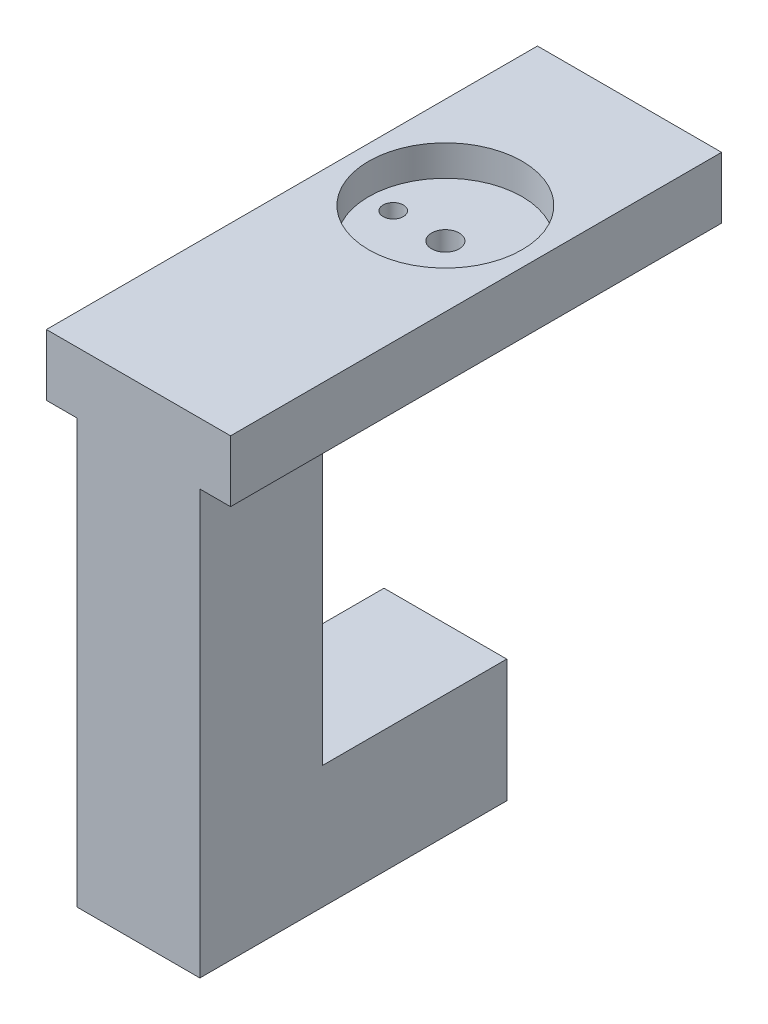
ISO-10303-21;
HEADER;
FILE_DESCRIPTION(('STEP AP214'),'2;1');
FILE_NAME('part.step','',(''),(''),'','','');
FILE_SCHEMA(('AUTOMOTIVE_DESIGN { 1 0 10303 214 1 1 1 1 }'));
ENDSEC;
DATA;
#1=APPLICATION_CONTEXT('core data for automotive mechanical design processes');
#2=APPLICATION_PROTOCOL_DEFINITION('international standard','automotive_design',2000,#1);
#3=PRODUCT_CONTEXT('',#1,'mechanical');
#4=PRODUCT('Part','Part','',(#3));
#5=PRODUCT_RELATED_PRODUCT_CATEGORY('part','',(#4));
#6=PRODUCT_DEFINITION_FORMATION('','',#4);
#7=PRODUCT_DEFINITION_CONTEXT('part definition',#1,'design');
#8=PRODUCT_DEFINITION('design','',#6,#7);
#9=PRODUCT_DEFINITION_SHAPE('','',#8);
#10=(LENGTH_UNIT() NAMED_UNIT(*) SI_UNIT(.MILLI.,.METRE.));
#11=(NAMED_UNIT(*) PLANE_ANGLE_UNIT() SI_UNIT($,.RADIAN.));
#12=(NAMED_UNIT(*) SI_UNIT($,.STERADIAN.) SOLID_ANGLE_UNIT());
#13=UNCERTAINTY_MEASURE_WITH_UNIT(LENGTH_MEASURE(1.E-05),#10,'distance_accuracy_value','');
#14=(GEOMETRIC_REPRESENTATION_CONTEXT(3) GLOBAL_UNCERTAINTY_ASSIGNED_CONTEXT((#13)) GLOBAL_UNIT_ASSIGNED_CONTEXT((#10,
#11,#12)) REPRESENTATION_CONTEXT('',''));
#15=CARTESIAN_POINT('',(0.,0.,0.));
#16=DIRECTION('',(0.,0.,1.));
#17=DIRECTION('',(1.,0.,0.));
#18=AXIS2_PLACEMENT_3D('',#15,#16,#17);
#19=CARTESIAN_POINT('',(-10.,10.,50.));
#20=DIRECTION('',(0.,-1.,0.));
#21=DIRECTION('',(0.,0.,-1.));
#22=AXIS2_PLACEMENT_3D('',#19,#20,#21);
#23=PLANE('',#22);
#24=DIRECTION('',(-1.,0.,0.));
#25=VECTOR('',#24,1.);
#26=CARTESIAN_POINT('',(-10.,10.,30.));
#27=LINE('',#26,#25);
#28=CARTESIAN_POINT('',(10.,10.,30.));
#29=VERTEX_POINT('',#28);
#30=CARTESIAN_POINT('',(-10.,10.,30.));
#31=VERTEX_POINT('',#30);
#32=EDGE_CURVE('E133',#29,#31,#27,.T.);
#33=ORIENTED_EDGE('',*,*,#32,.F.);
#34=DIRECTION('',(0.,0.,-1.));
#35=VECTOR('',#34,1.);
#36=CARTESIAN_POINT('',(10.,10.,50.));
#37=LINE('',#36,#35);
#38=CARTESIAN_POINT('',(10.,10.,0.));
#39=VERTEX_POINT('',#38);
#40=EDGE_CURVE('E54',#29,#39,#37,.T.);
#41=ORIENTED_EDGE('',*,*,#40,.T.);
#42=DIRECTION('',(-1.,0.,0.));
#43=VECTOR('',#42,1.);
#44=CARTESIAN_POINT('',(-10.,10.,0.));
#45=LINE('',#44,#43);
#46=CARTESIAN_POINT('',(-10.,10.,0.));
#47=VERTEX_POINT('',#46);
#48=EDGE_CURVE('E112',#39,#47,#45,.T.);
#49=ORIENTED_EDGE('',*,*,#48,.T.);
#50=DIRECTION('',(0.,0.,-1.));
#51=VECTOR('',#50,1.);
#52=CARTESIAN_POINT('',(-10.,10.,50.));
#53=LINE('',#52,#51);
#54=EDGE_CURVE('E127',#31,#47,#53,.T.);
#55=ORIENTED_EDGE('',*,*,#54,.F.);
#56=EDGE_LOOP('',(#33,#41,#49,#55));
#57=FACE_BOUND('',#56,.T.);
#58=ADVANCED_FACE('F44',(#57),#23,.F.);
#59=CARTESIAN_POINT('',(10.,10.,50.));
#60=DIRECTION('',(-1.,0.,0.));
#61=DIRECTION('',(0.,-1.,0.));
#62=AXIS2_PLACEMENT_3D('',#59,#60,#61);
#63=PLANE('',#62);
#64=DIRECTION('',(0.,-1.,0.));
#65=VECTOR('',#64,1.);
#66=CARTESIAN_POINT('',(10.,69.,30.));
#67=LINE('',#66,#65);
#68=CARTESIAN_POINT('',(10.,59.,30.));
#69=VERTEX_POINT('',#68);
#70=EDGE_CURVE('E60',#69,#29,#67,.T.);
#71=ORIENTED_EDGE('',*,*,#70,.F.);
#72=DIRECTION('',(0.,0.,1.));
#73=VECTOR('',#72,1.);
#74=CARTESIAN_POINT('',(9.99999999999999,59.,50.));
#75=LINE('',#74,#73);
#76=CARTESIAN_POINT('',(10.,59.,50.));
#77=VERTEX_POINT('',#76);
#78=EDGE_CURVE('E137',#69,#77,#75,.T.);
#79=ORIENTED_EDGE('',*,*,#78,.T.);
#80=DIRECTION('',(0.,1.,0.));
#81=VECTOR('',#80,1.);
#82=CARTESIAN_POINT('',(10.,10.,50.));
#83=LINE('',#82,#81);
#84=CARTESIAN_POINT('',(10.,-10.,50.));
#85=VERTEX_POINT('',#84);
#86=EDGE_CURVE('E99',#85,#77,#83,.T.);
#87=ORIENTED_EDGE('',*,*,#86,.F.);
#88=DIRECTION('',(0.,0.,-1.));
#89=VECTOR('',#88,1.);
#90=CARTESIAN_POINT('',(10.,-10.,50.));
#91=LINE('',#90,#89);
#92=CARTESIAN_POINT('',(10.,-10.,0.));
#93=VERTEX_POINT('',#92);
#94=EDGE_CURVE('E91',#85,#93,#91,.T.);
#95=ORIENTED_EDGE('',*,*,#94,.T.);
#96=DIRECTION('',(0.,1.,0.));
#97=VECTOR('',#96,1.);
#98=CARTESIAN_POINT('',(10.,10.,0.));
#99=LINE('',#98,#97);
#100=EDGE_CURVE('E105',#93,#39,#99,.T.);
#101=ORIENTED_EDGE('',*,*,#100,.T.);
#102=ORIENTED_EDGE('',*,*,#40,.F.);
#103=EDGE_LOOP('',(#71,#79,#87,#95,#101,#102));
#104=FACE_BOUND('',#103,.T.);
#105=ADVANCED_FACE('F46',(#104),#63,.F.);
#106=CARTESIAN_POINT('',(-10.,10.,50.));
#107=DIRECTION('',(1.,0.,0.));
#108=DIRECTION('',(0.,1.,0.));
#109=AXIS2_PLACEMENT_3D('',#106,#107,#108);
#110=PLANE('',#109);
#111=DIRECTION('',(0.,-1.,0.));
#112=VECTOR('',#111,1.);
#113=CARTESIAN_POINT('',(-10.,10.,50.));
#114=LINE('',#113,#112);
#115=CARTESIAN_POINT('',(-10.,59.,50.));
#116=VERTEX_POINT('',#115);
#117=CARTESIAN_POINT('',(-10.,-10.,50.));
#118=VERTEX_POINT('',#117);
#119=EDGE_CURVE('E248',#116,#118,#114,.T.);
#120=ORIENTED_EDGE('',*,*,#119,.F.);
#121=DIRECTION('',(0.,0.,-1.));
#122=VECTOR('',#121,1.);
#123=CARTESIAN_POINT('',(-10.,59.,50.));
#124=LINE('',#123,#122);
#125=CARTESIAN_POINT('',(-10.,59.,30.));
#126=VERTEX_POINT('',#125);
#127=EDGE_CURVE('E229',#116,#126,#124,.T.);
#128=ORIENTED_EDGE('',*,*,#127,.T.);
#129=DIRECTION('',(0.,-1.,0.));
#130=VECTOR('',#129,1.);
#131=CARTESIAN_POINT('',(-10.,69.,30.));
#132=LINE('',#131,#130);
#133=EDGE_CURVE('E118',#126,#31,#132,.T.);
#134=ORIENTED_EDGE('',*,*,#133,.T.);
#135=ORIENTED_EDGE('',*,*,#54,.T.);
#136=DIRECTION('',(0.,-1.,0.));
#137=VECTOR('',#136,1.);
#138=CARTESIAN_POINT('',(-10.,10.,0.));
#139=LINE('',#138,#137);
#140=CARTESIAN_POINT('',(-10.,-10.,0.));
#141=VERTEX_POINT('',#140);
#142=EDGE_CURVE('E100',#47,#141,#139,.T.);
#143=ORIENTED_EDGE('',*,*,#142,.T.);
#144=DIRECTION('',(0.,0.,-1.));
#145=VECTOR('',#144,1.);
#146=CARTESIAN_POINT('',(-10.,-10.,50.));
#147=LINE('',#146,#145);
#148=EDGE_CURVE('E94',#118,#141,#147,.T.);
#149=ORIENTED_EDGE('',*,*,#148,.F.);
#150=EDGE_LOOP('',(#120,#128,#134,#135,#143,#149));
#151=FACE_BOUND('',#150,.T.);
#152=ADVANCED_FACE('F255',(#151),#110,.F.);
#153=CARTESIAN_POINT('',(-10.,-10.,50.));
#154=DIRECTION('',(0.,1.,0.));
#155=DIRECTION('',(0.,0.,1.));
#156=AXIS2_PLACEMENT_3D('',#153,#154,#155);
#157=PLANE('',#156);
#158=DIRECTION('',(1.,0.,0.));
#159=VECTOR('',#158,1.);
#160=CARTESIAN_POINT('',(-10.,-10.,0.));
#161=LINE('',#160,#159);
#162=EDGE_CURVE('E88',#141,#93,#161,.T.);
#163=ORIENTED_EDGE('',*,*,#162,.T.);
#164=ORIENTED_EDGE('',*,*,#94,.F.);
#165=DIRECTION('',(1.,0.,0.));
#166=VECTOR('',#165,1.);
#167=CARTESIAN_POINT('',(-10.,-10.,50.));
#168=LINE('',#167,#166);
#169=EDGE_CURVE('E69',#118,#85,#168,.T.);
#170=ORIENTED_EDGE('',*,*,#169,.F.);
#171=ORIENTED_EDGE('',*,*,#148,.T.);
#172=EDGE_LOOP('',(#163,#164,#170,#171));
#173=FACE_BOUND('',#172,.T.);
#174=ADVANCED_FACE('F90',(#173),#157,.F.);
#175=CARTESIAN_POINT('',(0.,0.,50.));
#176=DIRECTION('',(0.,0.,1.));
#177=DIRECTION('',(1.,0.,0.));
#178=AXIS2_PLACEMENT_3D('',#175,#176,#177);
#179=PLANE('',#178);
#180=ORIENTED_EDGE('',*,*,#86,.T.);
#181=DIRECTION('',(-1.,0.,0.));
#182=VECTOR('',#181,1.);
#183=CARTESIAN_POINT('',(15.,59.,50.));
#184=LINE('',#183,#182);
#185=CARTESIAN_POINT('',(15.,59.,50.));
#186=VERTEX_POINT('',#185);
#187=EDGE_CURVE('E188',#186,#77,#184,.T.);
#188=ORIENTED_EDGE('',*,*,#187,.F.);
#189=DIRECTION('',(0.,-1.,0.));
#190=VECTOR('',#189,1.);
#191=CARTESIAN_POINT('',(15.,69.,50.));
#192=LINE('',#191,#190);
#193=CARTESIAN_POINT('',(15.,69.,50.));
#194=VERTEX_POINT('',#193);
#195=EDGE_CURVE('E219',#194,#186,#192,.T.);
#196=ORIENTED_EDGE('',*,*,#195,.F.);
#197=DIRECTION('',(1.,0.,0.));
#198=VECTOR('',#197,1.);
#199=CARTESIAN_POINT('',(-10.,69.,50.));
#200=LINE('',#199,#198);
#201=CARTESIAN_POINT('',(-15.,69.,50.));
#202=VERTEX_POINT('',#201);
#203=EDGE_CURVE('E240',#202,#194,#200,.T.);
#204=ORIENTED_EDGE('',*,*,#203,.F.);
#205=DIRECTION('',(0.,1.,0.));
#206=VECTOR('',#205,1.);
#207=CARTESIAN_POINT('',(-15.,69.,50.));
#208=LINE('',#207,#206);
#209=CARTESIAN_POINT('',(-15.,59.,50.));
#210=VERTEX_POINT('',#209);
#211=EDGE_CURVE('E184',#210,#202,#208,.T.);
#212=ORIENTED_EDGE('',*,*,#211,.F.);
#213=EDGE_CURVE('E223',#116,#210,#184,.T.);
#214=ORIENTED_EDGE('',*,*,#213,.F.);
#215=ORIENTED_EDGE('',*,*,#119,.T.);
#216=ORIENTED_EDGE('',*,*,#169,.T.);
#217=EDGE_LOOP('',(#180,#188,#196,#204,#212,#214,#215,#216));
#218=FACE_BOUND('',#217,.T.);
#219=ADVANCED_FACE('F253',(#218),#179,.T.);
#220=CARTESIAN_POINT('',(0.,0.,0.));
#221=DIRECTION('',(0.,0.,1.));
#222=DIRECTION('',(1.,0.,0.));
#223=AXIS2_PLACEMENT_3D('',#220,#221,#222);
#224=PLANE('',#223);
#225=ORIENTED_EDGE('',*,*,#100,.F.);
#226=ORIENTED_EDGE('',*,*,#162,.F.);
#227=ORIENTED_EDGE('',*,*,#142,.F.);
#228=ORIENTED_EDGE('',*,*,#48,.F.);
#229=EDGE_LOOP('',(#225,#226,#227,#228));
#230=FACE_BOUND('',#229,.T.);
#231=ADVANCED_FACE('F110',(#230),#224,.F.);
#232=CARTESIAN_POINT('',(-10.,69.,30.));
#233=DIRECTION('',(0.,0.,1.));
#234=DIRECTION('',(1.,0.,0.));
#235=AXIS2_PLACEMENT_3D('',#232,#233,#234);
#236=PLANE('',#235);
#237=ORIENTED_EDGE('',*,*,#133,.F.);
#238=DIRECTION('',(1.,0.,0.));
#239=VECTOR('',#238,1.);
#240=CARTESIAN_POINT('',(-10.,59.,30.));
#241=LINE('',#240,#239);
#242=EDGE_CURVE('E11',#126,#69,#241,.T.);
#243=ORIENTED_EDGE('',*,*,#242,.T.);
#244=ORIENTED_EDGE('',*,*,#70,.T.);
#245=ORIENTED_EDGE('',*,*,#32,.T.);
#246=EDGE_LOOP('',(#237,#243,#244,#245));
#247=FACE_BOUND('',#246,.T.);
#248=ADVANCED_FACE('F257',(#247),#236,.F.);
#249=CARTESIAN_POINT('',(0.,69.,0.));
#250=DIRECTION('',(0.,-1.,0.));
#251=DIRECTION('',(0.,0.,-1.));
#252=AXIS2_PLACEMENT_3D('',#249,#250,#251);
#253=PLANE('',#252);
#254=CARTESIAN_POINT('',(0.,69.,0.));
#255=DIRECTION('',(0.,1.,0.));
#256=DIRECTION('',(0.,0.,1.));
#257=AXIS2_PLACEMENT_3D('',#254,#255,#256);
#258=CIRCLE('',#257,12.5);
#259=CARTESIAN_POINT('',(0.,69.,12.5));
#260=VERTEX_POINT('',#259);
#261=EDGE_CURVE('E209',#260,#260,#258,.T.);
#262=ORIENTED_EDGE('',*,*,#261,.F.);
#263=EDGE_LOOP('',(#262));
#264=FACE_BOUND('',#263,.T.);
#265=DIRECTION('',(0.,0.,-1.));
#266=VECTOR('',#265,1.);
#267=CARTESIAN_POINT('',(-15.,69.,50.));
#268=LINE('',#267,#266);
#269=CARTESIAN_POINT('',(-15.,69.,-30.));
#270=VERTEX_POINT('',#269);
#271=EDGE_CURVE('E177',#202,#270,#268,.T.);
#272=ORIENTED_EDGE('',*,*,#271,.F.);
#273=ORIENTED_EDGE('',*,*,#203,.T.);
#274=DIRECTION('',(0.,0.,-1.));
#275=VECTOR('',#274,1.);
#276=CARTESIAN_POINT('',(15.,69.,50.));
#277=LINE('',#276,#275);
#278=CARTESIAN_POINT('',(15.,69.,-30.));
#279=VERTEX_POINT('',#278);
#280=EDGE_CURVE('E187',#194,#279,#277,.T.);
#281=ORIENTED_EDGE('',*,*,#280,.T.);
#282=DIRECTION('',(1.,0.,0.));
#283=VECTOR('',#282,1.);
#284=CARTESIAN_POINT('',(15.,69.,-30.));
#285=LINE('',#284,#283);
#286=EDGE_CURVE('E191',#270,#279,#285,.T.);
#287=ORIENTED_EDGE('',*,*,#286,.F.);
#288=EDGE_LOOP('',(#272,#273,#281,#287));
#289=FACE_BOUND('',#288,.T.);
#290=ADVANCED_FACE('F192',(#264,#289),#253,.F.);
#291=CARTESIAN_POINT('',(15.,59.,50.));
#292=DIRECTION('',(0.,-1.,0.));
#293=DIRECTION('',(0.,0.,-1.));
#294=AXIS2_PLACEMENT_3D('',#291,#292,#293);
#295=PLANE('',#294);
#296=CARTESIAN_POINT('',(8.5,59.,0.));
#297=DIRECTION('',(0.,-1.,0.));
#298=DIRECTION('',(0.,0.,-1.));
#299=AXIS2_PLACEMENT_3D('',#296,#297,#298);
#300=CIRCLE('',#299,1.65);
#301=CARTESIAN_POINT('',(8.5,59.,-1.65));
#302=VERTEX_POINT('',#301);
#303=EDGE_CURVE('E307',#302,#302,#300,.T.);
#304=ORIENTED_EDGE('',*,*,#303,.F.);
#305=EDGE_LOOP('',(#304));
#306=FACE_BOUND('',#305,.T.);
#307=CARTESIAN_POINT('',(-8.5,59.,0.));
#308=DIRECTION('',(0.,-1.,0.));
#309=DIRECTION('',(0.,0.,-1.));
#310=AXIS2_PLACEMENT_3D('',#307,#308,#309);
#311=CIRCLE('',#310,1.65);
#312=CARTESIAN_POINT('',(-8.5,59.,-1.65));
#313=VERTEX_POINT('',#312);
#314=EDGE_CURVE('E313',#313,#313,#311,.T.);
#315=ORIENTED_EDGE('',*,*,#314,.F.);
#316=EDGE_LOOP('',(#315));
#317=FACE_BOUND('',#316,.T.);
#318=CARTESIAN_POINT('',(0.,59.,0.));
#319=DIRECTION('',(0.,-1.,0.));
#320=DIRECTION('',(0.,0.,-1.));
#321=AXIS2_PLACEMENT_3D('',#318,#319,#320);
#322=CIRCLE('',#321,2.25);
#323=CARTESIAN_POINT('',(0.,59.,-2.25));
#324=VERTEX_POINT('',#323);
#325=EDGE_CURVE('E48',#324,#324,#322,.T.);
#326=ORIENTED_EDGE('',*,*,#325,.F.);
#327=EDGE_LOOP('',(#326));
#328=FACE_BOUND('',#327,.T.);
#329=ORIENTED_EDGE('',*,*,#78,.F.);
#330=ORIENTED_EDGE('',*,*,#242,.F.);
#331=ORIENTED_EDGE('',*,*,#127,.F.);
#332=ORIENTED_EDGE('',*,*,#213,.T.);
#333=DIRECTION('',(0.,0.,-1.));
#334=VECTOR('',#333,1.);
#335=CARTESIAN_POINT('',(-15.,59.,50.));
#336=LINE('',#335,#334);
#337=CARTESIAN_POINT('',(-15.,59.,-30.));
#338=VERTEX_POINT('',#337);
#339=EDGE_CURVE('E226',#210,#338,#336,.T.);
#340=ORIENTED_EDGE('',*,*,#339,.T.);
#341=DIRECTION('',(-1.,0.,0.));
#342=VECTOR('',#341,1.);
#343=CARTESIAN_POINT('',(15.,59.,-30.));
#344=LINE('',#343,#342);
#345=CARTESIAN_POINT('',(15.,59.,-30.));
#346=VERTEX_POINT('',#345);
#347=EDGE_CURVE('E203',#346,#338,#344,.T.);
#348=ORIENTED_EDGE('',*,*,#347,.F.);
#349=DIRECTION('',(0.,0.,-1.));
#350=VECTOR('',#349,1.);
#351=CARTESIAN_POINT('',(15.,59.,50.));
#352=LINE('',#351,#350);
#353=EDGE_CURVE('E230',#186,#346,#352,.T.);
#354=ORIENTED_EDGE('',*,*,#353,.F.);
#355=ORIENTED_EDGE('',*,*,#187,.T.);
#356=EDGE_LOOP('',(#329,#330,#331,#332,#340,#348,#354,#355));
#357=FACE_BOUND('',#356,.T.);
#358=ADVANCED_FACE('F258',(#306,#317,#328,#357),#295,.T.);
#359=CARTESIAN_POINT('',(-15.,69.,50.));
#360=DIRECTION('',(-1.,0.,0.));
#361=DIRECTION('',(0.,-1.,0.));
#362=AXIS2_PLACEMENT_3D('',#359,#360,#361);
#363=PLANE('',#362);
#364=ORIENTED_EDGE('',*,*,#271,.T.);
#365=DIRECTION('',(0.,1.,0.));
#366=VECTOR('',#365,1.);
#367=CARTESIAN_POINT('',(-15.,69.,-30.));
#368=LINE('',#367,#366);
#369=EDGE_CURVE('E182',#338,#270,#368,.T.);
#370=ORIENTED_EDGE('',*,*,#369,.F.);
#371=ORIENTED_EDGE('',*,*,#339,.F.);
#372=ORIENTED_EDGE('',*,*,#211,.T.);
#373=EDGE_LOOP('',(#364,#370,#371,#372));
#374=FACE_BOUND('',#373,.T.);
#375=ADVANCED_FACE('F179',(#374),#363,.T.);
#376=CARTESIAN_POINT('',(15.,69.,50.));
#377=DIRECTION('',(1.,0.,0.));
#378=DIRECTION('',(0.,1.,0.));
#379=AXIS2_PLACEMENT_3D('',#376,#377,#378);
#380=PLANE('',#379);
#381=ORIENTED_EDGE('',*,*,#353,.T.);
#382=DIRECTION('',(0.,-1.,0.));
#383=VECTOR('',#382,1.);
#384=CARTESIAN_POINT('',(15.,69.,-30.));
#385=LINE('',#384,#383);
#386=EDGE_CURVE('E198',#279,#346,#385,.T.);
#387=ORIENTED_EDGE('',*,*,#386,.F.);
#388=ORIENTED_EDGE('',*,*,#280,.F.);
#389=ORIENTED_EDGE('',*,*,#195,.T.);
#390=EDGE_LOOP('',(#381,#387,#388,#389));
#391=FACE_BOUND('',#390,.T.);
#392=ADVANCED_FACE('F263',(#391),#380,.T.);
#393=CARTESIAN_POINT('',(0.,0.,-30.));
#394=DIRECTION('',(0.,0.,-1.));
#395=DIRECTION('',(-1.,0.,0.));
#396=AXIS2_PLACEMENT_3D('',#393,#394,#395);
#397=PLANE('',#396);
#398=ORIENTED_EDGE('',*,*,#369,.T.);
#399=ORIENTED_EDGE('',*,*,#286,.T.);
#400=ORIENTED_EDGE('',*,*,#386,.T.);
#401=ORIENTED_EDGE('',*,*,#347,.T.);
#402=EDGE_LOOP('',(#398,#399,#400,#401));
#403=FACE_BOUND('',#402,.T.);
#404=ADVANCED_FACE('F201',(#403),#397,.T.);
#405=CARTESIAN_POINT('',(0.,64.,0.));
#406=DIRECTION('',(0.,1.,0.));
#407=DIRECTION('',(0.,0.,1.));
#408=AXIS2_PLACEMENT_3D('',#405,#406,#407);
#409=CYLINDRICAL_SURFACE('',#408,12.5);
#410=CARTESIAN_POINT('',(0.,64.,0.));
#411=DIRECTION('',(0.,1.,0.));
#412=DIRECTION('',(0.,0.,1.));
#413=AXIS2_PLACEMENT_3D('',#410,#411,#412);
#414=CIRCLE('',#413,12.5);
#415=CARTESIAN_POINT('',(0.,64.,12.5));
#416=VERTEX_POINT('',#415);
#417=EDGE_CURVE('E205',#416,#416,#414,.T.);
#418=ORIENTED_EDGE('',*,*,#417,.F.);
#419=EDGE_LOOP('',(#418));
#420=FACE_BOUND('',#419,.T.);
#421=ORIENTED_EDGE('',*,*,#261,.T.);
#422=EDGE_LOOP('',(#421));
#423=FACE_BOUND('',#422,.T.);
#424=ADVANCED_FACE('F270',(#420,#423),#409,.F.);
#425=CARTESIAN_POINT('',(0.,64.,0.));
#426=DIRECTION('',(0.,1.,0.));
#427=DIRECTION('',(0.,0.,1.));
#428=AXIS2_PLACEMENT_3D('',#425,#426,#427);
#429=PLANE('',#428);
#430=CARTESIAN_POINT('',(8.5,64.,0.));
#431=DIRECTION('',(0.,1.,0.));
#432=DIRECTION('',(0.,0.,1.));
#433=AXIS2_PLACEMENT_3D('',#430,#431,#432);
#434=CIRCLE('',#433,1.65);
#435=CARTESIAN_POINT('',(8.5,64.,1.65));
#436=VERTEX_POINT('',#435);
#437=EDGE_CURVE('E319',#436,#436,#434,.T.);
#438=ORIENTED_EDGE('',*,*,#437,.F.);
#439=EDGE_LOOP('',(#438));
#440=FACE_BOUND('',#439,.T.);
#441=CARTESIAN_POINT('',(-8.5,64.,0.));
#442=DIRECTION('',(0.,1.,0.));
#443=DIRECTION('',(0.,0.,-1.));
#444=AXIS2_PLACEMENT_3D('',#441,#442,#443);
#445=CIRCLE('',#444,1.65);
#446=CARTESIAN_POINT('',(-8.5,64.,-1.65));
#447=VERTEX_POINT('',#446);
#448=EDGE_CURVE('E320',#447,#447,#445,.T.);
#449=ORIENTED_EDGE('',*,*,#448,.F.);
#450=EDGE_LOOP('',(#449));
#451=FACE_BOUND('',#450,.T.);
#452=CARTESIAN_POINT('',(0.,64.,0.));
#453=DIRECTION('',(0.,1.,0.));
#454=DIRECTION('',(0.,0.,1.));
#455=AXIS2_PLACEMENT_3D('',#452,#453,#454);
#456=CIRCLE('',#455,2.25);
#457=CARTESIAN_POINT('',(0.,64.,2.25));
#458=VERTEX_POINT('',#457);
#459=EDGE_CURVE('E302',#458,#458,#456,.T.);
#460=ORIENTED_EDGE('',*,*,#459,.F.);
#461=EDGE_LOOP('',(#460));
#462=FACE_BOUND('',#461,.T.);
#463=ORIENTED_EDGE('',*,*,#417,.T.);
#464=EDGE_LOOP('',(#463));
#465=FACE_BOUND('',#464,.T.);
#466=ADVANCED_FACE('F330',(#440,#451,#462,#465),#429,.T.);
#467=CARTESIAN_POINT('',(0.,54.,0.));
#468=DIRECTION('',(0.,1.,0.));
#469=DIRECTION('',(0.,0.,1.));
#470=AXIS2_PLACEMENT_3D('',#467,#468,#469);
#471=CYLINDRICAL_SURFACE('',#470,2.25);
#472=ORIENTED_EDGE('',*,*,#325,.T.);
#473=EDGE_LOOP('',(#472));
#474=FACE_BOUND('',#473,.T.);
#475=ORIENTED_EDGE('',*,*,#459,.T.);
#476=EDGE_LOOP('',(#475));
#477=FACE_BOUND('',#476,.T.);
#478=ADVANCED_FACE('F333',(#474,#477),#471,.F.);
#479=CARTESIAN_POINT('',(-8.5,54.,0.));
#480=DIRECTION('',(0.,1.,0.));
#481=DIRECTION('',(0.,0.,1.));
#482=AXIS2_PLACEMENT_3D('',#479,#480,#481);
#483=CYLINDRICAL_SURFACE('',#482,1.65);
#484=ORIENTED_EDGE('',*,*,#314,.T.);
#485=EDGE_LOOP('',(#484));
#486=FACE_BOUND('',#485,.T.);
#487=ORIENTED_EDGE('',*,*,#448,.T.);
#488=EDGE_LOOP('',(#487));
#489=FACE_BOUND('',#488,.T.);
#490=ADVANCED_FACE('F346',(#486,#489),#483,.F.);
#491=CARTESIAN_POINT('',(8.5,54.,0.));
#492=DIRECTION('',(0.,1.,0.));
#493=DIRECTION('',(0.,0.,1.));
#494=AXIS2_PLACEMENT_3D('',#491,#492,#493);
#495=CYLINDRICAL_SURFACE('',#494,1.65);
#496=ORIENTED_EDGE('',*,*,#303,.T.);
#497=EDGE_LOOP('',(#496));
#498=FACE_BOUND('',#497,.T.);
#499=ORIENTED_EDGE('',*,*,#437,.T.);
#500=EDGE_LOOP('',(#499));
#501=FACE_BOUND('',#500,.T.);
#502=ADVANCED_FACE('F328',(#498,#501),#495,.F.);
#503=CLOSED_SHELL('',(#58,#105,#152,#174,#219,#231,#248,#290,#358,#375,#392,#404,#424,#466,#478,
#490,#502));
#504=MANIFOLD_SOLID_BREP('B2',#503);
#505=ADVANCED_BREP_SHAPE_REPRESENTATION('',(#18,#504),#14);
#506=SHAPE_DEFINITION_REPRESENTATION(#9,#505);
ENDSEC;
END-ISO-10303-21;
